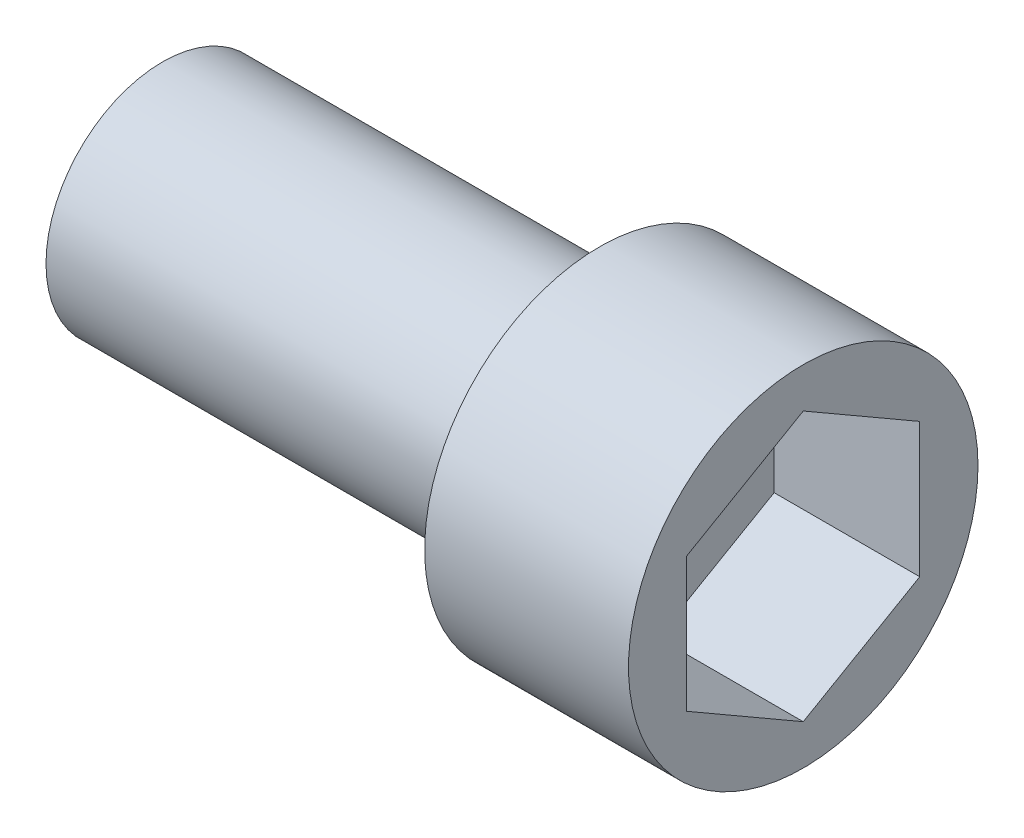
ISO-10303-21;
HEADER;
FILE_DESCRIPTION(('STEP AP214'),'2;1');
FILE_NAME('part.step','',(''),(''),'','','');
FILE_SCHEMA(('AUTOMOTIVE_DESIGN { 1 0 10303 214 1 1 1 1 }'));
ENDSEC;
DATA;
#1=APPLICATION_CONTEXT('core data for automotive mechanical design processes');
#2=APPLICATION_PROTOCOL_DEFINITION('international standard','automotive_design',2000,#1);
#3=PRODUCT_CONTEXT('',#1,'mechanical');
#4=PRODUCT('Part','Part','',(#3));
#5=PRODUCT_RELATED_PRODUCT_CATEGORY('part','',(#4));
#6=PRODUCT_DEFINITION_FORMATION('','',#4);
#7=PRODUCT_DEFINITION_CONTEXT('part definition',#1,'design');
#8=PRODUCT_DEFINITION('design','',#6,#7);
#9=PRODUCT_DEFINITION_SHAPE('','',#8);
#10=(LENGTH_UNIT() NAMED_UNIT(*) SI_UNIT(.MILLI.,.METRE.));
#11=(NAMED_UNIT(*) PLANE_ANGLE_UNIT() SI_UNIT($,.RADIAN.));
#12=(NAMED_UNIT(*) SI_UNIT($,.STERADIAN.) SOLID_ANGLE_UNIT());
#13=UNCERTAINTY_MEASURE_WITH_UNIT(LENGTH_MEASURE(1.E-05),#10,'distance_accuracy_value','');
#14=(GEOMETRIC_REPRESENTATION_CONTEXT(3) GLOBAL_UNCERTAINTY_ASSIGNED_CONTEXT((#13)) GLOBAL_UNIT_ASSIGNED_CONTEXT((#10,
#11,#12)) REPRESENTATION_CONTEXT('',''));
#15=CARTESIAN_POINT('',(0.,0.,0.));
#16=DIRECTION('',(0.,0.,1.));
#17=DIRECTION('',(1.,0.,0.));
#18=AXIS2_PLACEMENT_3D('',#15,#16,#17);
#19=CARTESIAN_POINT('',(7.,0.,0.));
#20=DIRECTION('',(-1.,0.,0.));
#21=DIRECTION('',(0.,0.,1.));
#22=AXIS2_PLACEMENT_3D('',#19,#20,#21);
#23=CYLINDRICAL_SURFACE('',#22,6.);
#24=CARTESIAN_POINT('',(7.,0.,0.));
#25=DIRECTION('',(1.,0.,0.));
#26=DIRECTION('',(0.,0.,-1.));
#27=AXIS2_PLACEMENT_3D('',#24,#25,#26);
#28=CIRCLE('',#27,6.);
#29=CARTESIAN_POINT('',(7.,0.,-6.));
#30=VERTEX_POINT('',#29);
#31=EDGE_CURVE('E54',#30,#30,#28,.T.);
#32=ORIENTED_EDGE('',*,*,#31,.F.);
#33=EDGE_LOOP('',(#32));
#34=FACE_BOUND('',#33,.T.);
#35=CARTESIAN_POINT('',(0.,0.,0.));
#36=DIRECTION('',(1.,0.,0.));
#37=DIRECTION('',(0.,0.,-1.));
#38=AXIS2_PLACEMENT_3D('',#35,#36,#37);
#39=CIRCLE('',#38,6.);
#40=CARTESIAN_POINT('',(0.,0.,-6.));
#41=VERTEX_POINT('',#40);
#42=EDGE_CURVE('E48',#41,#41,#39,.T.);
#43=ORIENTED_EDGE('',*,*,#42,.T.);
#44=EDGE_LOOP('',(#43));
#45=FACE_BOUND('',#44,.T.);
#46=ADVANCED_FACE('F45',(#34,#45),#23,.T.);
#47=CARTESIAN_POINT('',(7.,0.,0.));
#48=DIRECTION('',(1.,0.,0.));
#49=DIRECTION('',(0.,0.,-1.));
#50=AXIS2_PLACEMENT_3D('',#47,#48,#49);
#51=PLANE('',#50);
#52=DIRECTION('',(0.,0.5,0.866025403784438));
#53=VECTOR('',#52,1.);
#54=CARTESIAN_POINT('',(7.,2.3094010767585,-4.));
#55=LINE('',#54,#53);
#56=CARTESIAN_POINT('',(7.,2.3094010767585,-4.));
#57=VERTEX_POINT('',#56);
#58=CARTESIAN_POINT('',(7.,4.61880215351701,0.));
#59=VERTEX_POINT('',#58);
#60=EDGE_CURVE('E62',#57,#59,#55,.T.);
#61=ORIENTED_EDGE('',*,*,#60,.F.);
#62=DIRECTION('',(0.,1.,0.));
#63=VECTOR('',#62,1.);
#64=CARTESIAN_POINT('',(7.,-2.3094010767585,-4.));
#65=LINE('',#64,#63);
#66=CARTESIAN_POINT('',(7.,-2.3094010767585,-4.));
#67=VERTEX_POINT('',#66);
#68=EDGE_CURVE('E156',#67,#57,#65,.T.);
#69=ORIENTED_EDGE('',*,*,#68,.F.);
#70=DIRECTION('',(0.,0.5,-0.866025403784439));
#71=VECTOR('',#70,1.);
#72=CARTESIAN_POINT('',(7.,-4.61880215351701,0.));
#73=LINE('',#72,#71);
#74=CARTESIAN_POINT('',(7.,-4.61880215351701,0.));
#75=VERTEX_POINT('',#74);
#76=EDGE_CURVE('E153',#75,#67,#73,.T.);
#77=ORIENTED_EDGE('',*,*,#76,.F.);
#78=DIRECTION('',(0.,-0.5,-0.866025403784439));
#79=VECTOR('',#78,1.);
#80=CARTESIAN_POINT('',(7.,-2.3094010767585,4.));
#81=LINE('',#80,#79);
#82=CARTESIAN_POINT('',(7.,-2.3094010767585,4.));
#83=VERTEX_POINT('',#82);
#84=EDGE_CURVE('E110',#83,#75,#81,.T.);
#85=ORIENTED_EDGE('',*,*,#84,.F.);
#86=DIRECTION('',(0.,-1.,0.));
#87=VECTOR('',#86,1.);
#88=CARTESIAN_POINT('',(7.,2.3094010767585,4.));
#89=LINE('',#88,#87);
#90=CARTESIAN_POINT('',(7.,2.3094010767585,4.));
#91=VERTEX_POINT('',#90);
#92=EDGE_CURVE('E147',#91,#83,#89,.T.);
#93=ORIENTED_EDGE('',*,*,#92,.F.);
#94=DIRECTION('',(0.,-0.5,0.866025403784438));
#95=VECTOR('',#94,1.);
#96=CARTESIAN_POINT('',(7.,4.61880215351701,0.));
#97=LINE('',#96,#95);
#98=EDGE_CURVE('E142',#59,#91,#97,.T.);
#99=ORIENTED_EDGE('',*,*,#98,.F.);
#100=EDGE_LOOP('',(#61,#69,#77,#85,#93,#99));
#101=FACE_BOUND('',#100,.T.);
#102=ORIENTED_EDGE('',*,*,#31,.T.);
#103=EDGE_LOOP('',(#102));
#104=FACE_BOUND('',#103,.T.);
#105=ADVANCED_FACE('F182',(#101,#104),#51,.T.);
#106=CARTESIAN_POINT('',(0.,0.,0.));
#107=DIRECTION('',(1.,0.,0.));
#108=DIRECTION('',(0.,0.,-1.));
#109=AXIS2_PLACEMENT_3D('',#106,#107,#108);
#110=PLANE('',#109);
#111=CARTESIAN_POINT('',(0.,0.,0.));
#112=DIRECTION('',(-1.,0.,0.));
#113=DIRECTION('',(0.,0.,1.));
#114=AXIS2_PLACEMENT_3D('',#111,#112,#113);
#115=CIRCLE('',#114,4.);
#116=CARTESIAN_POINT('',(0.,0.,4.));
#117=VERTEX_POINT('',#116);
#118=EDGE_CURVE('E11',#117,#117,#115,.T.);
#119=ORIENTED_EDGE('',*,*,#118,.F.);
#120=EDGE_LOOP('',(#119));
#121=FACE_BOUND('',#120,.T.);
#122=ORIENTED_EDGE('',*,*,#42,.F.);
#123=EDGE_LOOP('',(#122));
#124=FACE_BOUND('',#123,.T.);
#125=ADVANCED_FACE('F179',(#121,#124),#110,.F.);
#126=CARTESIAN_POINT('',(2.,2.3094010767585,-4.));
#127=DIRECTION('',(0.,0.866025403784439,-0.5));
#128=DIRECTION('',(0.,0.5,0.866025403784439));
#129=AXIS2_PLACEMENT_3D('',#126,#127,#128);
#130=PLANE('',#129);
#131=ORIENTED_EDGE('',*,*,#60,.T.);
#132=DIRECTION('',(1.,0.,0.));
#133=VECTOR('',#132,1.);
#134=CARTESIAN_POINT('',(2.,4.61880215351701,0.));
#135=LINE('',#134,#133);
#136=CARTESIAN_POINT('',(2.,4.61880215351701,0.));
#137=VERTEX_POINT('',#136);
#138=EDGE_CURVE('E92',#137,#59,#135,.T.);
#139=ORIENTED_EDGE('',*,*,#138,.F.);
#140=DIRECTION('',(0.,0.5,0.866025403784438));
#141=VECTOR('',#140,1.);
#142=CARTESIAN_POINT('',(2.,2.3094010767585,-4.));
#143=LINE('',#142,#141);
#144=CARTESIAN_POINT('',(2.,2.3094010767585,-4.));
#145=VERTEX_POINT('',#144);
#146=EDGE_CURVE('E159',#145,#137,#143,.T.);
#147=ORIENTED_EDGE('',*,*,#146,.F.);
#148=DIRECTION('',(1.,0.,0.));
#149=VECTOR('',#148,1.);
#150=CARTESIAN_POINT('',(2.,2.3094010767585,-4.));
#151=LINE('',#150,#149);
#152=EDGE_CURVE('E70',#145,#57,#151,.T.);
#153=ORIENTED_EDGE('',*,*,#152,.T.);
#154=EDGE_LOOP('',(#131,#139,#147,#153));
#155=FACE_BOUND('',#154,.T.);
#156=ADVANCED_FACE('F181',(#155),#130,.F.);
#157=CARTESIAN_POINT('',(2.,-2.3094010767585,-4.));
#158=DIRECTION('',(0.,0.,-1.));
#159=DIRECTION('',(-1.,0.,0.));
#160=AXIS2_PLACEMENT_3D('',#157,#158,#159);
#161=PLANE('',#160);
#162=ORIENTED_EDGE('',*,*,#68,.T.);
#163=ORIENTED_EDGE('',*,*,#152,.F.);
#164=DIRECTION('',(0.,1.,0.));
#165=VECTOR('',#164,1.);
#166=CARTESIAN_POINT('',(2.,-2.3094010767585,-4.));
#167=LINE('',#166,#165);
#168=CARTESIAN_POINT('',(2.,-2.3094010767585,-4.));
#169=VERTEX_POINT('',#168);
#170=EDGE_CURVE('E124',#169,#145,#167,.T.);
#171=ORIENTED_EDGE('',*,*,#170,.F.);
#172=DIRECTION('',(1.,0.,0.));
#173=VECTOR('',#172,1.);
#174=CARTESIAN_POINT('',(2.,-2.3094010767585,-4.));
#175=LINE('',#174,#173);
#176=EDGE_CURVE('E115',#169,#67,#175,.T.);
#177=ORIENTED_EDGE('',*,*,#176,.T.);
#178=EDGE_LOOP('',(#162,#163,#171,#177));
#179=FACE_BOUND('',#178,.T.);
#180=ADVANCED_FACE('F189',(#179),#161,.F.);
#181=CARTESIAN_POINT('',(2.,-4.61880215351701,0.));
#182=DIRECTION('',(0.,-0.866025403784438,-0.5));
#183=DIRECTION('',(0.,0.5,-0.866025403784439));
#184=AXIS2_PLACEMENT_3D('',#181,#182,#183);
#185=PLANE('',#184);
#186=ORIENTED_EDGE('',*,*,#76,.T.);
#187=ORIENTED_EDGE('',*,*,#176,.F.);
#188=DIRECTION('',(0.,0.5,-0.866025403784439));
#189=VECTOR('',#188,1.);
#190=CARTESIAN_POINT('',(2.,-4.61880215351701,0.));
#191=LINE('',#190,#189);
#192=CARTESIAN_POINT('',(2.,-4.61880215351701,0.));
#193=VERTEX_POINT('',#192);
#194=EDGE_CURVE('E119',#193,#169,#191,.T.);
#195=ORIENTED_EDGE('',*,*,#194,.F.);
#196=DIRECTION('',(1.,0.,0.));
#197=VECTOR('',#196,1.);
#198=CARTESIAN_POINT('',(2.,-4.61880215351701,0.));
#199=LINE('',#198,#197);
#200=EDGE_CURVE('E103',#193,#75,#199,.T.);
#201=ORIENTED_EDGE('',*,*,#200,.T.);
#202=EDGE_LOOP('',(#186,#187,#195,#201));
#203=FACE_BOUND('',#202,.T.);
#204=ADVANCED_FACE('F120',(#203),#185,.F.);
#205=CARTESIAN_POINT('',(2.,-2.3094010767585,4.));
#206=DIRECTION('',(0.,-0.866025403784438,0.5));
#207=DIRECTION('',(0.,-0.5,-0.866025403784439));
#208=AXIS2_PLACEMENT_3D('',#205,#206,#207);
#209=PLANE('',#208);
#210=ORIENTED_EDGE('',*,*,#84,.T.);
#211=ORIENTED_EDGE('',*,*,#200,.F.);
#212=DIRECTION('',(0.,-0.5,-0.866025403784439));
#213=VECTOR('',#212,1.);
#214=CARTESIAN_POINT('',(2.,-2.3094010767585,4.));
#215=LINE('',#214,#213);
#216=CARTESIAN_POINT('',(2.,-2.3094010767585,4.));
#217=VERTEX_POINT('',#216);
#218=EDGE_CURVE('E107',#217,#193,#215,.T.);
#219=ORIENTED_EDGE('',*,*,#218,.F.);
#220=DIRECTION('',(1.,0.,0.));
#221=VECTOR('',#220,1.);
#222=CARTESIAN_POINT('',(2.,-2.3094010767585,4.));
#223=LINE('',#222,#221);
#224=EDGE_CURVE('E116',#217,#83,#223,.T.);
#225=ORIENTED_EDGE('',*,*,#224,.T.);
#226=EDGE_LOOP('',(#210,#211,#219,#225));
#227=FACE_BOUND('',#226,.T.);
#228=ADVANCED_FACE('F105',(#227),#209,.F.);
#229=CARTESIAN_POINT('',(2.,2.3094010767585,4.));
#230=DIRECTION('',(0.,0.,1.));
#231=DIRECTION('',(1.,0.,0.));
#232=AXIS2_PLACEMENT_3D('',#229,#230,#231);
#233=PLANE('',#232);
#234=ORIENTED_EDGE('',*,*,#92,.T.);
#235=ORIENTED_EDGE('',*,*,#224,.F.);
#236=DIRECTION('',(0.,-1.,0.));
#237=VECTOR('',#236,1.);
#238=CARTESIAN_POINT('',(2.,2.3094010767585,4.));
#239=LINE('',#238,#237);
#240=CARTESIAN_POINT('',(2.,2.3094010767585,4.));
#241=VERTEX_POINT('',#240);
#242=EDGE_CURVE('E130',#241,#217,#239,.T.);
#243=ORIENTED_EDGE('',*,*,#242,.F.);
#244=DIRECTION('',(1.,0.,0.));
#245=VECTOR('',#244,1.);
#246=CARTESIAN_POINT('',(2.,2.3094010767585,4.));
#247=LINE('',#246,#245);
#248=EDGE_CURVE('E166',#241,#91,#247,.T.);
#249=ORIENTED_EDGE('',*,*,#248,.T.);
#250=EDGE_LOOP('',(#234,#235,#243,#249));
#251=FACE_BOUND('',#250,.T.);
#252=ADVANCED_FACE('F230',(#251),#233,.F.);
#253=CARTESIAN_POINT('',(2.,4.61880215351701,0.));
#254=DIRECTION('',(0.,0.866025403784438,0.5));
#255=DIRECTION('',(0.,-0.5,0.866025403784439));
#256=AXIS2_PLACEMENT_3D('',#253,#254,#255);
#257=PLANE('',#256);
#258=ORIENTED_EDGE('',*,*,#98,.T.);
#259=ORIENTED_EDGE('',*,*,#248,.F.);
#260=DIRECTION('',(0.,-0.5,0.866025403784438));
#261=VECTOR('',#260,1.);
#262=CARTESIAN_POINT('',(2.,4.61880215351701,0.));
#263=LINE('',#262,#261);
#264=EDGE_CURVE('E134',#137,#241,#263,.T.);
#265=ORIENTED_EDGE('',*,*,#264,.F.);
#266=ORIENTED_EDGE('',*,*,#138,.T.);
#267=EDGE_LOOP('',(#258,#259,#265,#266));
#268=FACE_BOUND('',#267,.T.);
#269=ADVANCED_FACE('F238',(#268),#257,.F.);
#270=CARTESIAN_POINT('',(2.,0.,0.));
#271=DIRECTION('',(1.,0.,0.));
#272=DIRECTION('',(0.,0.,-1.));
#273=AXIS2_PLACEMENT_3D('',#270,#271,#272);
#274=PLANE('',#273);
#275=ORIENTED_EDGE('',*,*,#146,.T.);
#276=ORIENTED_EDGE('',*,*,#264,.T.);
#277=ORIENTED_EDGE('',*,*,#242,.T.);
#278=ORIENTED_EDGE('',*,*,#218,.T.);
#279=ORIENTED_EDGE('',*,*,#194,.T.);
#280=ORIENTED_EDGE('',*,*,#170,.T.);
#281=EDGE_LOOP('',(#275,#276,#277,#278,#279,#280));
#282=FACE_BOUND('',#281,.T.);
#283=ADVANCED_FACE('F127',(#282),#274,.T.);
#284=CARTESIAN_POINT('',(-15.,0.,0.));
#285=DIRECTION('',(1.,0.,0.));
#286=DIRECTION('',(0.,0.,-1.));
#287=AXIS2_PLACEMENT_3D('',#284,#285,#286);
#288=CYLINDRICAL_SURFACE('',#287,4.);
#289=CARTESIAN_POINT('',(-15.,0.,0.));
#290=DIRECTION('',(-1.,0.,0.));
#291=DIRECTION('',(0.,0.,1.));
#292=AXIS2_PLACEMENT_3D('',#289,#290,#291);
#293=CIRCLE('',#292,4.);
#294=CARTESIAN_POINT('',(-15.,0.,4.));
#295=VERTEX_POINT('',#294);
#296=EDGE_CURVE('E143',#295,#295,#293,.T.);
#297=ORIENTED_EDGE('',*,*,#296,.F.);
#298=EDGE_LOOP('',(#297));
#299=FACE_BOUND('',#298,.T.);
#300=ORIENTED_EDGE('',*,*,#118,.T.);
#301=EDGE_LOOP('',(#300));
#302=FACE_BOUND('',#301,.T.);
#303=ADVANCED_FACE('F253',(#299,#302),#288,.T.);
#304=CARTESIAN_POINT('',(-15.,0.,0.));
#305=DIRECTION('',(-1.,0.,0.));
#306=DIRECTION('',(0.,0.,1.));
#307=AXIS2_PLACEMENT_3D('',#304,#305,#306);
#308=PLANE('',#307);
#309=ORIENTED_EDGE('',*,*,#296,.T.);
#310=EDGE_LOOP('',(#309));
#311=FACE_BOUND('',#310,.T.);
#312=ADVANCED_FACE('F264',(#311),#308,.T.);
#313=CLOSED_SHELL('',(#46,#105,#125,#156,#180,#204,#228,#252,#269,#283,#303,#312));
#314=MANIFOLD_SOLID_BREP('B2',#313);
#315=ADVANCED_BREP_SHAPE_REPRESENTATION('',(#18,#314),#14);
#316=SHAPE_DEFINITION_REPRESENTATION(#9,#315);
ENDSEC;
END-ISO-10303-21;
